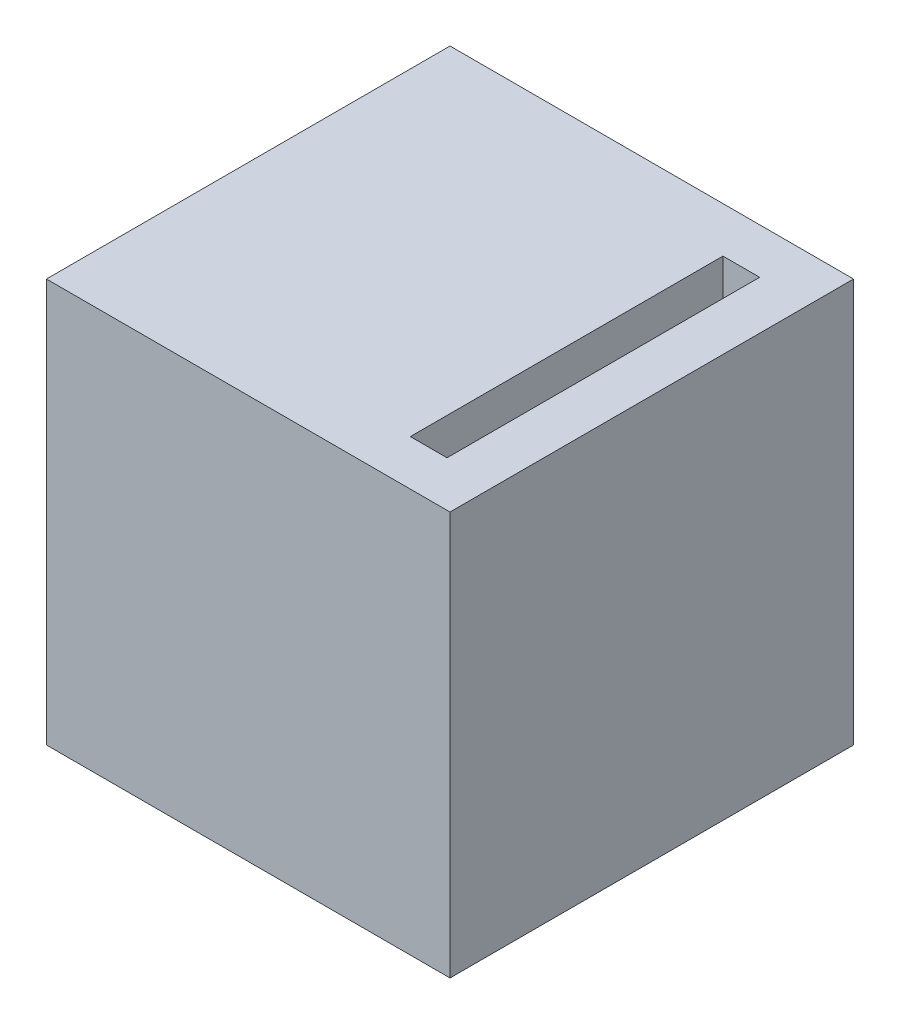
ISO-10303-21;
HEADER;
FILE_DESCRIPTION(('STEP AP214'),'2;1');
FILE_NAME('part.step','',(''),(''),'','','');
FILE_SCHEMA(('AUTOMOTIVE_DESIGN { 1 0 10303 214 1 1 1 1 }'));
ENDSEC;
DATA;
#1=APPLICATION_CONTEXT('core data for automotive mechanical design processes');
#2=APPLICATION_PROTOCOL_DEFINITION('international standard','automotive_design',2000,#1);
#3=PRODUCT_CONTEXT('',#1,'mechanical');
#4=PRODUCT('Part','Part','',(#3));
#5=PRODUCT_RELATED_PRODUCT_CATEGORY('part','',(#4));
#6=PRODUCT_DEFINITION_FORMATION('','',#4);
#7=PRODUCT_DEFINITION_CONTEXT('part definition',#1,'design');
#8=PRODUCT_DEFINITION('design','',#6,#7);
#9=PRODUCT_DEFINITION_SHAPE('','',#8);
#10=(LENGTH_UNIT() NAMED_UNIT(*) SI_UNIT(.MILLI.,.METRE.));
#11=(NAMED_UNIT(*) PLANE_ANGLE_UNIT() SI_UNIT($,.RADIAN.));
#12=(NAMED_UNIT(*) SI_UNIT($,.STERADIAN.) SOLID_ANGLE_UNIT());
#13=UNCERTAINTY_MEASURE_WITH_UNIT(LENGTH_MEASURE(1.E-05),#10,'distance_accuracy_value','');
#14=(GEOMETRIC_REPRESENTATION_CONTEXT(3) GLOBAL_UNCERTAINTY_ASSIGNED_CONTEXT((#13)) GLOBAL_UNIT_ASSIGNED_CONTEXT((#10,
#11,#12)) REPRESENTATION_CONTEXT('',''));
#15=CARTESIAN_POINT('',(0.,0.,0.));
#16=DIRECTION('',(0.,0.,1.));
#17=DIRECTION('',(1.,0.,0.));
#18=AXIS2_PLACEMENT_3D('',#15,#16,#17);
#19=CARTESIAN_POINT('',(0.,5.,0.));
#20=DIRECTION('',(0.,-1.,0.));
#21=DIRECTION('',(0.,0.,-1.));
#22=AXIS2_PLACEMENT_3D('',#19,#20,#21);
#23=PLANE('',#22);
#24=DIRECTION('',(1.,0.,0.));
#25=VECTOR('',#24,1.);
#26=CARTESIAN_POINT('',(-39.3746601619192,5.,30.1100001208557));
#27=LINE('',#26,#25);
#28=CARTESIAN_POINT('',(-39.3746601619192,5.,30.1100001208557));
#29=VERTEX_POINT('',#28);
#30=CARTESIAN_POINT('',(-34.3746601619192,5.,30.1100001208557));
#31=VERTEX_POINT('',#30);
#32=EDGE_CURVE('E89',#29,#31,#27,.T.);
#33=ORIENTED_EDGE('',*,*,#32,.T.);
#34=DIRECTION('',(0.,0.,1.));
#35=VECTOR('',#34,1.);
#36=CARTESIAN_POINT('',(-34.3746601619192,5.,25.1100001208557));
#37=LINE('',#36,#35);
#38=CARTESIAN_POINT('',(-34.3746601619192,5.,25.1100001208557));
#39=VERTEX_POINT('',#38);
#40=EDGE_CURVE('E166',#39,#31,#37,.T.);
#41=ORIENTED_EDGE('',*,*,#40,.F.);
#42=DIRECTION('',(1.,0.,0.));
#43=VECTOR('',#42,1.);
#44=CARTESIAN_POINT('',(-39.3746601619192,5.,25.1100001208557));
#45=LINE('',#44,#43);
#46=CARTESIAN_POINT('',(-39.3746601619192,5.,25.1100001208557));
#47=VERTEX_POINT('',#46);
#48=EDGE_CURVE('E170',#47,#39,#45,.T.);
#49=ORIENTED_EDGE('',*,*,#48,.F.);
#50=DIRECTION('',(0.,0.,1.));
#51=VECTOR('',#50,1.);
#52=CARTESIAN_POINT('',(-39.3746601619192,5.,25.1100001208557));
#53=LINE('',#52,#51);
#54=EDGE_CURVE('E64',#47,#29,#53,.T.);
#55=ORIENTED_EDGE('',*,*,#54,.T.);
#56=EDGE_LOOP('',(#33,#41,#49,#55));
#57=FACE_BOUND('',#56,.T.);
#58=DIRECTION('',(0.,0.,1.));
#59=VECTOR('',#58,1.);
#60=CARTESIAN_POINT('',(-34.9746601619192,5.,0.));
#61=LINE('',#60,#59);
#62=CARTESIAN_POINT('',(-34.9746601619192,5.,25.6732818940105));
#63=VERTEX_POINT('',#62);
#64=CARTESIAN_POINT('',(-34.9746601619192,5.,29.546718347701));
#65=VERTEX_POINT('',#64);
#66=EDGE_CURVE('E55',#63,#65,#61,.T.);
#67=ORIENTED_EDGE('',*,*,#66,.T.);
#68=DIRECTION('',(1.,0.,0.));
#69=VECTOR('',#68,1.);
#70=CARTESIAN_POINT('',(0.,5.,29.546718347701));
#71=LINE('',#70,#69);
#72=CARTESIAN_POINT('',(-35.4296475988843,5.,29.546718347701));
#73=VERTEX_POINT('',#72);
#74=EDGE_CURVE('E136',#73,#65,#71,.T.);
#75=ORIENTED_EDGE('',*,*,#74,.F.);
#76=DIRECTION('',(0.,0.,1.));
#77=VECTOR('',#76,1.);
#78=CARTESIAN_POINT('',(-35.4296475988845,5.,1.26937704377336E-13));
#79=LINE('',#78,#77);
#80=CARTESIAN_POINT('',(-35.4296475988844,5.,25.6732818940105));
#81=VERTEX_POINT('',#80);
#82=EDGE_CURVE('E140',#81,#73,#79,.T.);
#83=ORIENTED_EDGE('',*,*,#82,.F.);
#84=DIRECTION('',(1.,0.,0.));
#85=VECTOR('',#84,1.);
#86=CARTESIAN_POINT('',(0.,5.,25.6732818940105));
#87=LINE('',#86,#85);
#88=EDGE_CURVE('E149',#81,#63,#87,.T.);
#89=ORIENTED_EDGE('',*,*,#88,.T.);
#90=EDGE_LOOP('',(#67,#75,#83,#89));
#91=FACE_BOUND('',#90,.T.);
#92=ADVANCED_FACE('F39',(#57,#91),#23,.F.);
#93=CARTESIAN_POINT('',(-39.3746601619192,5.,30.1100001208557));
#94=DIRECTION('',(0.,0.,-1.));
#95=DIRECTION('',(-1.,0.,0.));
#96=AXIS2_PLACEMENT_3D('',#93,#94,#95);
#97=PLANE('',#96);
#98=DIRECTION('',(1.,0.,0.));
#99=VECTOR('',#98,1.);
#100=CARTESIAN_POINT('',(-39.3746601619192,0.,30.1100001208557));
#101=LINE('',#100,#99);
#102=CARTESIAN_POINT('',(-39.3746601619192,0.,30.1100001208557));
#103=VERTEX_POINT('',#102);
#104=CARTESIAN_POINT('',(-34.3746601619192,0.,30.1100001208557));
#105=VERTEX_POINT('',#104);
#106=EDGE_CURVE('E158',#103,#105,#101,.T.);
#107=ORIENTED_EDGE('',*,*,#106,.T.);
#108=DIRECTION('',(0.,-1.,0.));
#109=VECTOR('',#108,1.);
#110=CARTESIAN_POINT('',(-34.3746601619192,5.,30.1100001208557));
#111=LINE('',#110,#109);
#112=EDGE_CURVE('E11',#31,#105,#111,.T.);
#113=ORIENTED_EDGE('',*,*,#112,.F.);
#114=ORIENTED_EDGE('',*,*,#32,.F.);
#115=DIRECTION('',(0.,-1.,0.));
#116=VECTOR('',#115,1.);
#117=CARTESIAN_POINT('',(-39.3746601619192,5.,30.1100001208557));
#118=LINE('',#117,#116);
#119=EDGE_CURVE('E176',#29,#103,#118,.T.);
#120=ORIENTED_EDGE('',*,*,#119,.T.);
#121=EDGE_LOOP('',(#107,#113,#114,#120));
#122=FACE_BOUND('',#121,.T.);
#123=ADVANCED_FACE('F41',(#122),#97,.F.);
#124=CARTESIAN_POINT('',(-34.3746601619192,5.,25.1100001208557));
#125=DIRECTION('',(1.,0.,0.));
#126=DIRECTION('',(0.,0.,-1.));
#127=AXIS2_PLACEMENT_3D('',#124,#125,#126);
#128=PLANE('',#127);
#129=DIRECTION('',(0.,0.,1.));
#130=VECTOR('',#129,1.);
#131=CARTESIAN_POINT('',(-34.3746601619192,0.,25.1100001208557));
#132=LINE('',#131,#130);
#133=CARTESIAN_POINT('',(-34.3746601619192,0.,25.1100001208557));
#134=VERTEX_POINT('',#133);
#135=EDGE_CURVE('E180',#134,#105,#132,.T.);
#136=ORIENTED_EDGE('',*,*,#135,.F.);
#137=DIRECTION('',(0.,-1.,0.));
#138=VECTOR('',#137,1.);
#139=CARTESIAN_POINT('',(-34.3746601619192,5.,25.1100001208557));
#140=LINE('',#139,#138);
#141=EDGE_CURVE('E48',#39,#134,#140,.T.);
#142=ORIENTED_EDGE('',*,*,#141,.F.);
#143=ORIENTED_EDGE('',*,*,#40,.T.);
#144=ORIENTED_EDGE('',*,*,#112,.T.);
#145=EDGE_LOOP('',(#136,#142,#143,#144));
#146=FACE_BOUND('',#145,.T.);
#147=ADVANCED_FACE('F200',(#146),#128,.T.);
#148=CARTESIAN_POINT('',(-39.3746601619192,5.,25.1100001208557));
#149=DIRECTION('',(0.,0.,-1.));
#150=DIRECTION('',(-1.,0.,0.));
#151=AXIS2_PLACEMENT_3D('',#148,#149,#150);
#152=PLANE('',#151);
#153=DIRECTION('',(1.,0.,0.));
#154=VECTOR('',#153,1.);
#155=CARTESIAN_POINT('',(-39.3746601619192,0.,25.1100001208557));
#156=LINE('',#155,#154);
#157=CARTESIAN_POINT('',(-39.3746601619192,0.,25.1100001208557));
#158=VERTEX_POINT('',#157);
#159=EDGE_CURVE('E184',#158,#134,#156,.T.);
#160=ORIENTED_EDGE('',*,*,#159,.F.);
#161=DIRECTION('',(0.,-1.,0.));
#162=VECTOR('',#161,1.);
#163=CARTESIAN_POINT('',(-39.3746601619192,5.,25.1100001208557));
#164=LINE('',#163,#162);
#165=EDGE_CURVE('E192',#47,#158,#164,.T.);
#166=ORIENTED_EDGE('',*,*,#165,.F.);
#167=ORIENTED_EDGE('',*,*,#48,.T.);
#168=ORIENTED_EDGE('',*,*,#141,.T.);
#169=EDGE_LOOP('',(#160,#166,#167,#168));
#170=FACE_BOUND('',#169,.T.);
#171=ADVANCED_FACE('F198',(#170),#152,.T.);
#172=CARTESIAN_POINT('',(-39.3746601619192,5.,25.1100001208557));
#173=DIRECTION('',(1.,0.,0.));
#174=DIRECTION('',(0.,0.,-1.));
#175=AXIS2_PLACEMENT_3D('',#172,#173,#174);
#176=PLANE('',#175);
#177=DIRECTION('',(0.,0.,1.));
#178=VECTOR('',#177,1.);
#179=CARTESIAN_POINT('',(-39.3746601619192,0.,25.1100001208557));
#180=LINE('',#179,#178);
#181=EDGE_CURVE('E84',#158,#103,#180,.T.);
#182=ORIENTED_EDGE('',*,*,#181,.T.);
#183=ORIENTED_EDGE('',*,*,#119,.F.);
#184=ORIENTED_EDGE('',*,*,#54,.F.);
#185=ORIENTED_EDGE('',*,*,#165,.T.);
#186=EDGE_LOOP('',(#182,#183,#184,#185));
#187=FACE_BOUND('',#186,.T.);
#188=ADVANCED_FACE('F205',(#187),#176,.F.);
#189=CARTESIAN_POINT('',(0.,0.,0.));
#190=DIRECTION('',(0.,-1.,0.));
#191=DIRECTION('',(0.,0.,-1.));
#192=AXIS2_PLACEMENT_3D('',#189,#190,#191);
#193=PLANE('',#192);
#194=ORIENTED_EDGE('',*,*,#106,.F.);
#195=ORIENTED_EDGE('',*,*,#181,.F.);
#196=ORIENTED_EDGE('',*,*,#159,.T.);
#197=ORIENTED_EDGE('',*,*,#135,.T.);
#198=EDGE_LOOP('',(#194,#195,#196,#197));
#199=FACE_BOUND('',#198,.T.);
#200=ADVANCED_FACE('F203',(#199),#193,.T.);
#201=CARTESIAN_POINT('',(-34.9746601619192,1.,0.));
#202=DIRECTION('',(-1.,0.,0.));
#203=DIRECTION('',(0.,0.,1.));
#204=AXIS2_PLACEMENT_3D('',#201,#202,#203);
#205=PLANE('',#204);
#206=ORIENTED_EDGE('',*,*,#66,.F.);
#207=DIRECTION('',(0.,1.,0.));
#208=VECTOR('',#207,1.);
#209=CARTESIAN_POINT('',(-34.9746601619192,1.,25.6732818940105));
#210=LINE('',#209,#208);
#211=CARTESIAN_POINT('',(-34.9746601619192,1.,25.6732818940105));
#212=VERTEX_POINT('',#211);
#213=EDGE_CURVE('E116',#212,#63,#210,.T.);
#214=ORIENTED_EDGE('',*,*,#213,.F.);
#215=DIRECTION('',(0.,0.,1.));
#216=VECTOR('',#215,1.);
#217=CARTESIAN_POINT('',(-34.9746601619192,1.,0.));
#218=LINE('',#217,#216);
#219=CARTESIAN_POINT('',(-34.9746601619192,1.,29.546718347701));
#220=VERTEX_POINT('',#219);
#221=EDGE_CURVE('E125',#212,#220,#218,.T.);
#222=ORIENTED_EDGE('',*,*,#221,.T.);
#223=DIRECTION('',(0.,1.,0.));
#224=VECTOR('',#223,1.);
#225=CARTESIAN_POINT('',(-34.9746601619192,1.,29.546718347701));
#226=LINE('',#225,#224);
#227=EDGE_CURVE('E155',#220,#65,#226,.T.);
#228=ORIENTED_EDGE('',*,*,#227,.T.);
#229=EDGE_LOOP('',(#206,#214,#222,#228));
#230=FACE_BOUND('',#229,.T.);
#231=ADVANCED_FACE('F127',(#230),#205,.T.);
#232=CARTESIAN_POINT('',(0.,1.,29.546718347701));
#233=DIRECTION('',(0.,0.,1.));
#234=DIRECTION('',(1.,0.,0.));
#235=AXIS2_PLACEMENT_3D('',#232,#233,#234);
#236=PLANE('',#235);
#237=ORIENTED_EDGE('',*,*,#74,.T.);
#238=ORIENTED_EDGE('',*,*,#227,.F.);
#239=DIRECTION('',(1.,0.,0.));
#240=VECTOR('',#239,1.);
#241=CARTESIAN_POINT('',(0.,1.,29.546718347701));
#242=LINE('',#241,#240);
#243=CARTESIAN_POINT('',(-35.4296475988843,1.,29.546718347701));
#244=VERTEX_POINT('',#243);
#245=EDGE_CURVE('E130',#244,#220,#242,.T.);
#246=ORIENTED_EDGE('',*,*,#245,.F.);
#247=DIRECTION('',(0.,1.,0.));
#248=VECTOR('',#247,1.);
#249=CARTESIAN_POINT('',(-35.4296475988843,1.,29.546718347701));
#250=LINE('',#249,#248);
#251=EDGE_CURVE('E159',#244,#73,#250,.T.);
#252=ORIENTED_EDGE('',*,*,#251,.T.);
#253=EDGE_LOOP('',(#237,#238,#246,#252));
#254=FACE_BOUND('',#253,.T.);
#255=ADVANCED_FACE('F214',(#254),#236,.F.);
#256=CARTESIAN_POINT('',(-35.4296475988845,1.,1.26937704377336E-13));
#257=DIRECTION('',(-1.,0.,0.));
#258=DIRECTION('',(0.,0.,1.));
#259=AXIS2_PLACEMENT_3D('',#256,#257,#258);
#260=PLANE('',#259);
#261=ORIENTED_EDGE('',*,*,#82,.T.);
#262=ORIENTED_EDGE('',*,*,#251,.F.);
#263=DIRECTION('',(0.,0.,1.));
#264=VECTOR('',#263,1.);
#265=CARTESIAN_POINT('',(-35.4296475988845,1.,1.26937704377336E-13));
#266=LINE('',#265,#264);
#267=CARTESIAN_POINT('',(-35.4296475988844,1.,25.6732818940105));
#268=VERTEX_POINT('',#267);
#269=EDGE_CURVE('E124',#268,#244,#266,.T.);
#270=ORIENTED_EDGE('',*,*,#269,.F.);
#271=DIRECTION('',(0.,1.,0.));
#272=VECTOR('',#271,1.);
#273=CARTESIAN_POINT('',(-35.4296475988844,1.,25.6732818940105));
#274=LINE('',#273,#272);
#275=EDGE_CURVE('E118',#268,#81,#274,.T.);
#276=ORIENTED_EDGE('',*,*,#275,.T.);
#277=EDGE_LOOP('',(#261,#262,#270,#276));
#278=FACE_BOUND('',#277,.T.);
#279=ADVANCED_FACE('F212',(#278),#260,.F.);
#280=CARTESIAN_POINT('',(0.,1.,25.6732818940105));
#281=DIRECTION('',(0.,0.,1.));
#282=DIRECTION('',(1.,0.,0.));
#283=AXIS2_PLACEMENT_3D('',#280,#281,#282);
#284=PLANE('',#283);
#285=ORIENTED_EDGE('',*,*,#88,.F.);
#286=ORIENTED_EDGE('',*,*,#275,.F.);
#287=DIRECTION('',(1.,0.,0.));
#288=VECTOR('',#287,1.);
#289=CARTESIAN_POINT('',(0.,1.,25.6732818940105));
#290=LINE('',#289,#288);
#291=EDGE_CURVE('E113',#268,#212,#290,.T.);
#292=ORIENTED_EDGE('',*,*,#291,.T.);
#293=ORIENTED_EDGE('',*,*,#213,.T.);
#294=EDGE_LOOP('',(#285,#286,#292,#293));
#295=FACE_BOUND('',#294,.T.);
#296=ADVANCED_FACE('F115',(#295),#284,.T.);
#297=CARTESIAN_POINT('',(0.,1.,0.));
#298=DIRECTION('',(0.,1.,0.));
#299=DIRECTION('',(0.,0.,1.));
#300=AXIS2_PLACEMENT_3D('',#297,#298,#299);
#301=PLANE('',#300);
#302=ORIENTED_EDGE('',*,*,#221,.F.);
#303=ORIENTED_EDGE('',*,*,#291,.F.);
#304=ORIENTED_EDGE('',*,*,#269,.T.);
#305=ORIENTED_EDGE('',*,*,#245,.T.);
#306=EDGE_LOOP('',(#302,#303,#304,#305));
#307=FACE_BOUND('',#306,.T.);
#308=ADVANCED_FACE('F133',(#307),#301,.T.);
#309=CLOSED_SHELL('',(#92,#123,#147,#171,#188,#200,#231,#255,#279,#296,#308));
#310=MANIFOLD_SOLID_BREP('B2',#309);
#311=ADVANCED_BREP_SHAPE_REPRESENTATION('',(#18,#310),#14);
#312=SHAPE_DEFINITION_REPRESENTATION(#9,#311);
ENDSEC;
END-ISO-10303-21;
